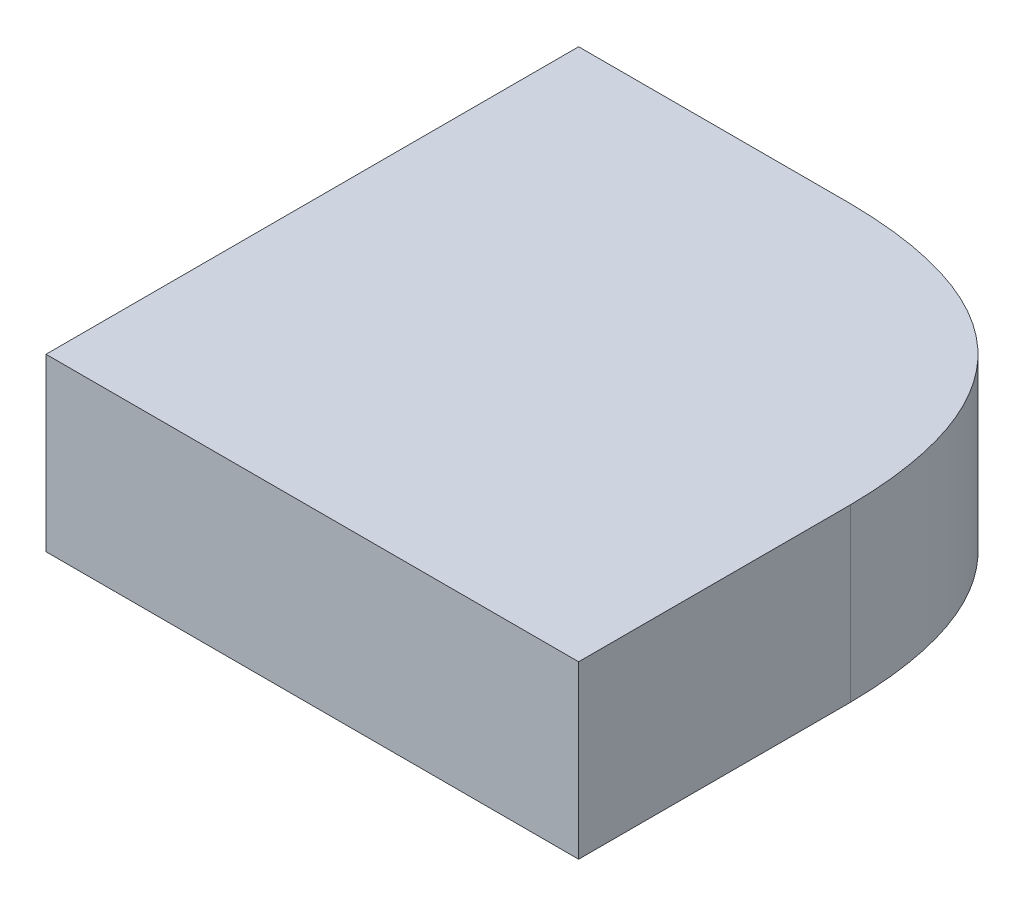
ISO-10303-21;
HEADER;
FILE_DESCRIPTION(('STEP AP214'),'2;1');
FILE_NAME('part.step','',(''),(''),'','','');
FILE_SCHEMA(('AUTOMOTIVE_DESIGN { 1 0 10303 214 1 1 1 1 }'));
ENDSEC;
DATA;
#1=APPLICATION_CONTEXT('core data for automotive mechanical design processes');
#2=APPLICATION_PROTOCOL_DEFINITION('international standard','automotive_design',2000,#1);
#3=PRODUCT_CONTEXT('',#1,'mechanical');
#4=PRODUCT('Part','Part','',(#3));
#5=PRODUCT_RELATED_PRODUCT_CATEGORY('part','',(#4));
#6=PRODUCT_DEFINITION_FORMATION('','',#4);
#7=PRODUCT_DEFINITION_CONTEXT('part definition',#1,'design');
#8=PRODUCT_DEFINITION('design','',#6,#7);
#9=PRODUCT_DEFINITION_SHAPE('','',#8);
#10=(LENGTH_UNIT() NAMED_UNIT(*) SI_UNIT(.MILLI.,.METRE.));
#11=(NAMED_UNIT(*) PLANE_ANGLE_UNIT() SI_UNIT($,.RADIAN.));
#12=(NAMED_UNIT(*) SI_UNIT($,.STERADIAN.) SOLID_ANGLE_UNIT());
#13=UNCERTAINTY_MEASURE_WITH_UNIT(LENGTH_MEASURE(1.E-05),#10,'distance_accuracy_value','');
#14=(GEOMETRIC_REPRESENTATION_CONTEXT(3) GLOBAL_UNCERTAINTY_ASSIGNED_CONTEXT((#13)) GLOBAL_UNIT_ASSIGNED_CONTEXT((#10,
#11,#12)) REPRESENTATION_CONTEXT('',''));
#15=CARTESIAN_POINT('',(0.,0.,0.));
#16=DIRECTION('',(0.,0.,1.));
#17=DIRECTION('',(1.,0.,0.));
#18=AXIS2_PLACEMENT_3D('',#15,#16,#17);
#19=CARTESIAN_POINT('',(0.,8.,-12.4557692307692));
#20=DIRECTION('',(0.,0.,1.));
#21=DIRECTION('',(1.,0.,0.));
#22=AXIS2_PLACEMENT_3D('',#19,#20,#21);
#23=PLANE('',#22);
#24=DIRECTION('',(-1.,0.,0.));
#25=VECTOR('',#24,1.);
#26=CARTESIAN_POINT('',(0.,0.,-12.4557692307692));
#27=LINE('',#26,#25);
#28=CARTESIAN_POINT('',(0.254,0.,-12.4557692307692));
#29=VERTEX_POINT('',#28);
#30=CARTESIAN_POINT('',(-12.4557692307692,0.,-12.4557692307692));
#31=VERTEX_POINT('',#30);
#32=EDGE_CURVE('E86',#29,#31,#27,.T.);
#33=ORIENTED_EDGE('',*,*,#32,.T.);
#34=DIRECTION('',(0.,-1.,0.));
#35=VECTOR('',#34,1.);
#36=CARTESIAN_POINT('',(-12.4557692307692,8.,-12.4557692307692));
#37=LINE('',#36,#35);
#38=CARTESIAN_POINT('',(-12.4557692307692,8.,-12.4557692307692));
#39=VERTEX_POINT('',#38);
#40=EDGE_CURVE('E11',#39,#31,#37,.T.);
#41=ORIENTED_EDGE('',*,*,#40,.F.);
#42=DIRECTION('',(-1.,0.,0.));
#43=VECTOR('',#42,1.);
#44=CARTESIAN_POINT('',(0.,8.,-12.4557692307692));
#45=LINE('',#44,#43);
#46=CARTESIAN_POINT('',(0.254,8.,-12.4557692307692));
#47=VERTEX_POINT('',#46);
#48=EDGE_CURVE('E92',#47,#39,#45,.T.);
#49=ORIENTED_EDGE('',*,*,#48,.F.);
#50=DIRECTION('',(0.,-1.,0.));
#51=VECTOR('',#50,1.);
#52=CARTESIAN_POINT('',(0.254,8.,-12.4557692307692));
#53=LINE('',#52,#51);
#54=EDGE_CURVE('E121',#47,#29,#53,.T.);
#55=ORIENTED_EDGE('',*,*,#54,.T.);
#56=EDGE_LOOP('',(#33,#41,#49,#55));
#57=FACE_BOUND('',#56,.T.);
#58=ADVANCED_FACE('F43',(#57),#23,.F.);
#59=CARTESIAN_POINT('',(-12.4557692307692,8.,12.4557692307692));
#60=DIRECTION('',(1.,0.,0.));
#61=DIRECTION('',(0.,0.,-1.));
#62=AXIS2_PLACEMENT_3D('',#59,#60,#61);
#63=PLANE('',#62);
#64=DIRECTION('',(0.,0.,1.));
#65=VECTOR('',#64,1.);
#66=CARTESIAN_POINT('',(-12.4557692307692,0.,12.4557692307692));
#67=LINE('',#66,#65);
#68=CARTESIAN_POINT('',(-12.4557692307692,0.,12.4557692307692));
#69=VERTEX_POINT('',#68);
#70=EDGE_CURVE('E150',#31,#69,#67,.T.);
#71=ORIENTED_EDGE('',*,*,#70,.T.);
#72=DIRECTION('',(0.,-1.,0.));
#73=VECTOR('',#72,1.);
#74=CARTESIAN_POINT('',(-12.4557692307692,8.,12.4557692307692));
#75=LINE('',#74,#73);
#76=CARTESIAN_POINT('',(-12.4557692307692,8.,12.4557692307692));
#77=VERTEX_POINT('',#76);
#78=EDGE_CURVE('E52',#77,#69,#75,.T.);
#79=ORIENTED_EDGE('',*,*,#78,.F.);
#80=DIRECTION('',(0.,0.,1.));
#81=VECTOR('',#80,1.);
#82=CARTESIAN_POINT('',(-12.4557692307692,8.,12.4557692307692));
#83=LINE('',#82,#81);
#84=EDGE_CURVE('E103',#39,#77,#83,.T.);
#85=ORIENTED_EDGE('',*,*,#84,.F.);
#86=ORIENTED_EDGE('',*,*,#40,.T.);
#87=EDGE_LOOP('',(#71,#79,#85,#86));
#88=FACE_BOUND('',#87,.T.);
#89=ADVANCED_FACE('F143',(#88),#63,.F.);
#90=CARTESIAN_POINT('',(12.4557692307692,8.,12.4557692307692));
#91=DIRECTION('',(0.,0.,-1.));
#92=DIRECTION('',(-1.,0.,0.));
#93=AXIS2_PLACEMENT_3D('',#90,#91,#92);
#94=PLANE('',#93);
#95=DIRECTION('',(1.,0.,0.));
#96=VECTOR('',#95,1.);
#97=CARTESIAN_POINT('',(12.4557692307692,0.,12.4557692307692));
#98=LINE('',#97,#96);
#99=CARTESIAN_POINT('',(12.4557692307692,0.,12.4557692307692));
#100=VERTEX_POINT('',#99);
#101=EDGE_CURVE('E113',#69,#100,#98,.T.);
#102=ORIENTED_EDGE('',*,*,#101,.T.);
#103=DIRECTION('',(0.,-1.,0.));
#104=VECTOR('',#103,1.);
#105=CARTESIAN_POINT('',(12.4557692307692,8.,12.4557692307692));
#106=LINE('',#105,#104);
#107=CARTESIAN_POINT('',(12.4557692307692,8.,12.4557692307692));
#108=VERTEX_POINT('',#107);
#109=EDGE_CURVE('E110',#108,#100,#106,.T.);
#110=ORIENTED_EDGE('',*,*,#109,.F.);
#111=DIRECTION('',(1.,0.,0.));
#112=VECTOR('',#111,1.);
#113=CARTESIAN_POINT('',(12.4557692307692,8.,12.4557692307692));
#114=LINE('',#113,#112);
#115=EDGE_CURVE('E97',#77,#108,#114,.T.);
#116=ORIENTED_EDGE('',*,*,#115,.F.);
#117=ORIENTED_EDGE('',*,*,#78,.T.);
#118=EDGE_LOOP('',(#102,#110,#116,#117));
#119=FACE_BOUND('',#118,.T.);
#120=ADVANCED_FACE('F111',(#119),#94,.F.);
#121=CARTESIAN_POINT('',(12.4557692307692,8.,0.));
#122=DIRECTION('',(-1.,0.,0.));
#123=DIRECTION('',(0.,0.,1.));
#124=AXIS2_PLACEMENT_3D('',#121,#122,#123);
#125=PLANE('',#124);
#126=DIRECTION('',(0.,0.,-1.));
#127=VECTOR('',#126,1.);
#128=CARTESIAN_POINT('',(12.4557692307692,0.,0.));
#129=LINE('',#128,#127);
#130=CARTESIAN_POINT('',(12.4557692307692,0.,-0.254));
#131=VERTEX_POINT('',#130);
#132=EDGE_CURVE('E79',#100,#131,#129,.T.);
#133=ORIENTED_EDGE('',*,*,#132,.T.);
#134=DIRECTION('',(0.,-1.,0.));
#135=VECTOR('',#134,1.);
#136=CARTESIAN_POINT('',(12.4557692307692,8.,-0.254));
#137=LINE('',#136,#135);
#138=CARTESIAN_POINT('',(12.4557692307692,8.,-0.254));
#139=VERTEX_POINT('',#138);
#140=EDGE_CURVE('E115',#139,#131,#137,.T.);
#141=ORIENTED_EDGE('',*,*,#140,.F.);
#142=DIRECTION('',(0.,0.,-1.));
#143=VECTOR('',#142,1.);
#144=CARTESIAN_POINT('',(12.4557692307692,8.,0.));
#145=LINE('',#144,#143);
#146=EDGE_CURVE('E101',#108,#139,#145,.T.);
#147=ORIENTED_EDGE('',*,*,#146,.F.);
#148=ORIENTED_EDGE('',*,*,#109,.T.);
#149=EDGE_LOOP('',(#133,#141,#147,#148));
#150=FACE_BOUND('',#149,.T.);
#151=ADVANCED_FACE('F117',(#150),#125,.F.);
#152=CARTESIAN_POINT('',(12.4557692307692,8.,-0.254));
#153=CARTESIAN_POINT('',(12.3240481164392,8.,-12.3240481164392));
#154=CARTESIAN_POINT('',(0.254,8.,-12.4557692307692));
#155=B_SPLINE_CURVE_WITH_KNOTS('',2,(#152,#153,#154),.UNSPECIFIED.,.F.,.F.,(3,3),(0.,1.),.UNSPECIFIED.);
#156=DIRECTION('',(0.,-1.,0.));
#157=VECTOR('',#156,1.);
#158=SURFACE_OF_LINEAR_EXTRUSION('',#155,#157);
#159=CARTESIAN_POINT('',(12.4557692307692,0.,-0.254));
#160=CARTESIAN_POINT('',(12.3240481164392,0.,-12.3240481164392));
#161=CARTESIAN_POINT('',(0.254,0.,-12.4557692307692));
#162=B_SPLINE_CURVE_WITH_KNOTS('',2,(#159,#160,#161),.UNSPECIFIED.,.F.,.F.,(3,3),(0.,1.),.UNSPECIFIED.);
#163=EDGE_CURVE('E156',#131,#29,#162,.T.);
#164=ORIENTED_EDGE('',*,*,#163,.T.);
#165=ORIENTED_EDGE('',*,*,#54,.F.);
#166=EDGE_CURVE('E60',#139,#47,#155,.T.);
#167=ORIENTED_EDGE('',*,*,#166,.F.);
#168=ORIENTED_EDGE('',*,*,#140,.T.);
#169=EDGE_LOOP('',(#164,#165,#167,#168));
#170=FACE_BOUND('',#169,.T.);
#171=ADVANCED_FACE('F133',(#170),#158,.F.);
#172=CARTESIAN_POINT('',(9.33946636591192,8.,-9.33946636591192));
#173=DIRECTION('',(0.,1.,0.));
#174=DIRECTION('',(0.,0.,1.));
#175=AXIS2_PLACEMENT_3D('',#172,#173,#174);
#176=PLANE('',#175);
#177=ORIENTED_EDGE('',*,*,#48,.T.);
#178=ORIENTED_EDGE('',*,*,#84,.T.);
#179=ORIENTED_EDGE('',*,*,#115,.T.);
#180=ORIENTED_EDGE('',*,*,#146,.T.);
#181=ORIENTED_EDGE('',*,*,#166,.T.);
#182=EDGE_LOOP('',(#177,#178,#179,#180,#181));
#183=FACE_BOUND('',#182,.T.);
#184=ADVANCED_FACE('F99',(#183),#176,.T.);
#185=CARTESIAN_POINT('',(9.33946636591192,0.,-9.33946636591192));
#186=DIRECTION('',(0.,1.,0.));
#187=DIRECTION('',(0.,0.,1.));
#188=AXIS2_PLACEMENT_3D('',#185,#186,#187);
#189=PLANE('',#188);
#190=ORIENTED_EDGE('',*,*,#32,.F.);
#191=ORIENTED_EDGE('',*,*,#163,.F.);
#192=ORIENTED_EDGE('',*,*,#132,.F.);
#193=ORIENTED_EDGE('',*,*,#101,.F.);
#194=ORIENTED_EDGE('',*,*,#70,.F.);
#195=EDGE_LOOP('',(#190,#191,#192,#193,#194));
#196=FACE_BOUND('',#195,.T.);
#197=ADVANCED_FACE('F138',(#196),#189,.F.);
#198=CLOSED_SHELL('',(#58,#89,#120,#151,#171,#184,#197));
#199=MANIFOLD_SOLID_BREP('B2',#198);
#200=ADVANCED_BREP_SHAPE_REPRESENTATION('',(#18,#199),#14);
#201=SHAPE_DEFINITION_REPRESENTATION(#9,#200);
ENDSEC;
END-ISO-10303-21;
